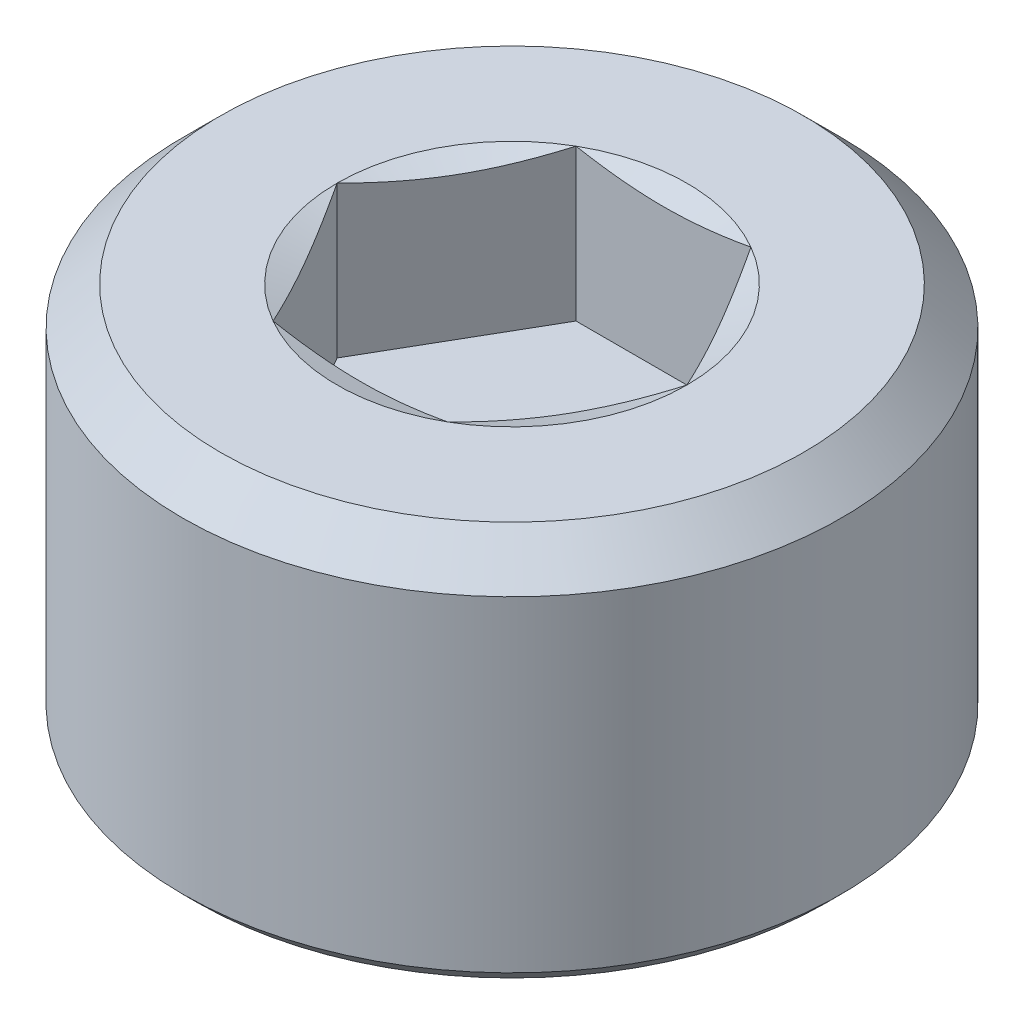
ISO-10303-21;
HEADER;
FILE_DESCRIPTION(('STEP AP214'),'2;1');
FILE_NAME('part.step','',(''),(''),'','','');
FILE_SCHEMA(('AUTOMOTIVE_DESIGN { 1 0 10303 214 1 1 1 1 }'));
ENDSEC;
DATA;
#1=APPLICATION_CONTEXT('core data for automotive mechanical design processes');
#2=APPLICATION_PROTOCOL_DEFINITION('international standard','automotive_design',2000,#1);
#3=PRODUCT_CONTEXT('',#1,'mechanical');
#4=PRODUCT('Part','Part','',(#3));
#5=PRODUCT_RELATED_PRODUCT_CATEGORY('part','',(#4));
#6=PRODUCT_DEFINITION_FORMATION('','',#4);
#7=PRODUCT_DEFINITION_CONTEXT('part definition',#1,'design');
#8=PRODUCT_DEFINITION('design','',#6,#7);
#9=PRODUCT_DEFINITION_SHAPE('','',#8);
#10=(LENGTH_UNIT() NAMED_UNIT(*) SI_UNIT(.MILLI.,.METRE.));
#11=(NAMED_UNIT(*) PLANE_ANGLE_UNIT() SI_UNIT($,.RADIAN.));
#12=(NAMED_UNIT(*) SI_UNIT($,.STERADIAN.) SOLID_ANGLE_UNIT());
#13=UNCERTAINTY_MEASURE_WITH_UNIT(LENGTH_MEASURE(1.E-05),#10,'distance_accuracy_value','');
#14=(GEOMETRIC_REPRESENTATION_CONTEXT(3) GLOBAL_UNCERTAINTY_ASSIGNED_CONTEXT((#13)) GLOBAL_UNIT_ASSIGNED_CONTEXT((#10,
#11,#12)) REPRESENTATION_CONTEXT('',''));
#15=CARTESIAN_POINT('',(0.,0.,0.));
#16=DIRECTION('',(0.,0.,1.));
#17=DIRECTION('',(1.,0.,0.));
#18=AXIS2_PLACEMENT_3D('',#15,#16,#17);
#19=CARTESIAN_POINT('',(0.,5.,0.));
#20=DIRECTION('',(0.,-1.,0.));
#21=DIRECTION('',(0.,0.,-1.));
#22=AXIS2_PLACEMENT_3D('',#19,#20,#21);
#23=CYLINDRICAL_SURFACE('',#22,4.35);
#24=CARTESIAN_POINT('',(0.,0.199999999999999,0.));
#25=DIRECTION('',(0.,1.,0.));
#26=DIRECTION('',(0.,0.,1.));
#27=AXIS2_PLACEMENT_3D('',#24,#25,#26);
#28=CIRCLE('',#27,4.35);
#29=CARTESIAN_POINT('',(0.,0.199999999999999,4.35));
#30=VERTEX_POINT('',#29);
#31=EDGE_CURVE('E52',#30,#30,#28,.T.);
#32=ORIENTED_EDGE('',*,*,#31,.T.);
#33=EDGE_LOOP('',(#32));
#34=FACE_BOUND('',#33,.T.);
#35=CARTESIAN_POINT('',(0.,4.5,0.));
#36=DIRECTION('',(0.,1.,0.));
#37=DIRECTION('',(0.,0.,1.));
#38=AXIS2_PLACEMENT_3D('',#35,#36,#37);
#39=CIRCLE('',#38,4.35);
#40=CARTESIAN_POINT('',(0.,4.5,4.35));
#41=VERTEX_POINT('',#40);
#42=EDGE_CURVE('E337',#41,#41,#39,.F.);
#43=ORIENTED_EDGE('',*,*,#42,.T.);
#44=EDGE_LOOP('',(#43));
#45=FACE_BOUND('',#44,.T.);
#46=ADVANCED_FACE('F43',(#34,#45),#23,.T.);
#47=CARTESIAN_POINT('',(0.,5.,0.));
#48=DIRECTION('',(0.,1.,0.));
#49=DIRECTION('',(0.,0.,1.));
#50=AXIS2_PLACEMENT_3D('',#47,#48,#49);
#51=PLANE('',#50);
#52=CARTESIAN_POINT('',(0.,5.,0.));
#53=DIRECTION('',(0.,1.,0.));
#54=DIRECTION('',(0.,0.,1.));
#55=AXIS2_PLACEMENT_3D('',#52,#53,#54);
#56=CIRCLE('',#55,3.85);
#57=CARTESIAN_POINT('',(0.,5.,3.85));
#58=VERTEX_POINT('',#57);
#59=EDGE_CURVE('E123',#58,#58,#56,.T.);
#60=ORIENTED_EDGE('',*,*,#59,.T.);
#61=EDGE_LOOP('',(#60));
#62=FACE_BOUND('',#61,.T.);
#63=CARTESIAN_POINT('',(0.,5.,0.));
#64=DIRECTION('',(0.,1.,0.));
#65=DIRECTION('',(0.,0.,1.));
#66=AXIS2_PLACEMENT_3D('',#63,#64,#65);
#67=CIRCLE('',#66,2.3094010767585);
#68=CARTESIAN_POINT('',(1.1547018557942,5.,2.00000228116781));
#69=VERTEX_POINT('',#68);
#70=CARTESIAN_POINT('',(2.3094010767585,5.,0.));
#71=VERTEX_POINT('',#70);
#72=EDGE_CURVE('E100',#69,#71,#67,.T.);
#73=ORIENTED_EDGE('',*,*,#72,.F.);
#74=CARTESIAN_POINT('',(-1.15470053837925,5.,2.));
#75=VERTEX_POINT('',#74);
#76=EDGE_CURVE('E58',#75,#69,#67,.T.);
#77=ORIENTED_EDGE('',*,*,#76,.F.);
#78=CARTESIAN_POINT('',(-2.3094010767585,5.,0.));
#79=VERTEX_POINT('',#78);
#80=EDGE_CURVE('E295',#79,#75,#67,.T.);
#81=ORIENTED_EDGE('',*,*,#80,.F.);
#82=CARTESIAN_POINT('',(-1.15470185579421,5.,-2.00000228116781));
#83=VERTEX_POINT('',#82);
#84=EDGE_CURVE('E66',#83,#79,#67,.T.);
#85=ORIENTED_EDGE('',*,*,#84,.F.);
#86=CARTESIAN_POINT('',(1.15469985166359,5.,-1.99999881004499));
#87=VERTEX_POINT('',#86);
#88=EDGE_CURVE('E145',#87,#83,#67,.T.);
#89=ORIENTED_EDGE('',*,*,#88,.F.);
#90=EDGE_CURVE('E111',#71,#87,#67,.T.);
#91=ORIENTED_EDGE('',*,*,#90,.F.);
#92=EDGE_LOOP('',(#73,#77,#81,#85,#89,#91));
#93=FACE_BOUND('',#92,.T.);
#94=ADVANCED_FACE('F144',(#62,#93),#51,.T.);
#95=CARTESIAN_POINT('',(0.,0.,0.));
#96=DIRECTION('',(0.,1.,0.));
#97=DIRECTION('',(0.,0.,1.));
#98=AXIS2_PLACEMENT_3D('',#95,#96,#97);
#99=PLANE('',#98);
#100=CARTESIAN_POINT('',(0.,0.,0.));
#101=DIRECTION('',(0.,1.,0.));
#102=DIRECTION('',(0.,0.,1.));
#103=AXIS2_PLACEMENT_3D('',#100,#101,#102);
#104=CIRCLE('',#103,4.15);
#105=CARTESIAN_POINT('',(0.,0.,4.15));
#106=VERTEX_POINT('',#105);
#107=EDGE_CURVE('E12',#106,#106,#104,.F.);
#108=ORIENTED_EDGE('',*,*,#107,.T.);
#109=EDGE_LOOP('',(#108));
#110=FACE_BOUND('',#109,.T.);
#111=ADVANCED_FACE('F165',(#110),#99,.F.);
#112=CARTESIAN_POINT('',(0.,4.7,0.));
#113=DIRECTION('',(0.,1.,0.));
#114=DIRECTION('',(0.,0.,1.));
#115=AXIS2_PLACEMENT_3D('',#112,#113,#114);
#116=CONICAL_SURFACE('',#115,1.5,1.21584969653141);
#117=ORIENTED_EDGE('',*,*,#90,.T.);
#118=CARTESIAN_POINT('',(2.30951654681234,5.0000428015419,0.000199999999999459));
#119=CARTESIAN_POINT('',(2.2616990180736,4.98231110108641,-0.0826223892678913));
#120=CARTESIAN_POINT('',(2.21371813834115,4.96617830162448,-0.16572771075634));
#121=CARTESIAN_POINT('',(2.11743284030509,4.93779178888623,-0.33249873897671));
#122=CARTESIAN_POINT('',(2.06912819095459,4.92554123557946,-0.416164845893564));
#123=CARTESIAN_POINT('',(1.97275103462017,4.90572913590812,-0.583094977353804));
#124=CARTESIAN_POINT('',(1.92468089421695,4.89812279889732,-0.666354902859147));
#125=CARTESIAN_POINT('',(1.8284240698117,4.8879203165271,-0.833076613304273));
#126=CARTESIAN_POINT('',(1.78023743869029,4.88532221454501,-0.916538306652137));
#127=CARTESIAN_POINT('',(1.68386417644747,4.88532221454501,-1.08346169334786));
#128=CARTESIAN_POINT('',(1.63567754532605,4.8879203165271,-1.16692338669573));
#129=CARTESIAN_POINT('',(1.53942072092081,4.89812279889732,-1.33364509714085));
#130=CARTESIAN_POINT('',(1.49135058051759,4.90572913590812,-1.4169050226462));
#131=CARTESIAN_POINT('',(1.39497342418316,4.92554123557946,-1.58383515410644));
#132=CARTESIAN_POINT('',(1.34666877483267,4.93779178888623,-1.66750126102329));
#133=CARTESIAN_POINT('',(1.2503834767966,4.96617830162448,-1.83427228924366));
#134=CARTESIAN_POINT('',(1.20240259706416,4.98231110108641,-1.91737761073211));
#135=CARTESIAN_POINT('',(1.15458506832541,5.0000428015419,-2.0002));
#136=B_SPLINE_CURVE_WITH_KNOTS('',3,(#118,#119,#120,#121,#122,#123,#124,#125,#126,#127,#128,
#129,#130,#131,#132,#133,#134,#135),.UNSPECIFIED.,.F.,.F.,(4,2,2,2,2,2,2,2,4),(0.,
0.291826340433017,0.583889607574753,0.873089675127141,1.16217673476816,1.45126379440919,
1.74046386196158,2.03252712910331,2.32435346953633),.UNSPECIFIED.);
#137=EDGE_CURVE('E117',#71,#87,#136,.T.);
#138=ORIENTED_EDGE('',*,*,#137,.F.);
#139=EDGE_LOOP('',(#117,#138));
#140=FACE_BOUND('',#139,.T.);
#141=ADVANCED_FACE('F118',(#140),#116,.F.);
#142=ORIENTED_EDGE('',*,*,#88,.T.);
#143=CARTESIAN_POINT('',(3.48371855259447,5.63291230268999,-2.));
#144=CARTESIAN_POINT('',(3.3487826248163,5.58956841889575,-2.));
#145=CARTESIAN_POINT('',(3.2136761428419,5.54673759086952,-2.));
#146=CARTESIAN_POINT('',(2.94296238835406,5.46258118319886,-2.));
#147=CARTESIAN_POINT('',(2.807355008678,5.42125594899759,-2.));
#148=CARTESIAN_POINT('',(2.53352754183587,5.34001263678583,-2.));
#149=CARTESIAN_POINT('',(2.39529851306173,5.30012447972504,-2.));
#150=CARTESIAN_POINT('',(2.1180458094453,5.22321630781469,-2.));
#151=CARTESIAN_POINT('',(1.97902216975503,5.1861961671282,-2.));
#152=CARTESIAN_POINT('',(1.70601505685474,5.11769516497388,-2.));
#153=CARTESIAN_POINT('',(1.57207521358363,5.08604345882237,-2.));
#154=CARTESIAN_POINT('',(1.37033154252605,5.0424041276242,-2.));
#155=CARTESIAN_POINT('',(1.30294359191739,5.02849719834776,-2.));
#156=CARTESIAN_POINT('',(1.16786010745201,5.00218459664255,-2.));
#157=CARTESIAN_POINT('',(1.1001645079874,4.98977926168497,-2.));
#158=CARTESIAN_POINT('',(0.897714603559934,4.95536243402508,-2.));
#159=CARTESIAN_POINT('',(0.762507863765337,4.93590703682516,-2.));
#160=CARTESIAN_POINT('',(0.491112040376663,4.9058435971261,-2.));
#161=CARTESIAN_POINT('',(0.354923290417337,4.89523268053384,-2.));
#162=CARTESIAN_POINT('',(0.141654072913857,4.88663498881944,-2.));
#163=CARTESIAN_POINT('',(0.0647051504781063,4.88516040069001,-2.));
#164=CARTESIAN_POINT('',(-0.0891887123532253,4.88551180076652,-2.));
#165=CARTESIAN_POINT('',(-0.166133652671896,4.88733783841127,-2.));
#166=CARTESIAN_POINT('',(-0.319895647186918,4.89421090097877,-2.));
#167=CARTESIAN_POINT('',(-0.396712666249752,4.8992586990056,-2.));
#168=CARTESIAN_POINT('',(-0.550093987387917,4.91235242572707,-2.));
#169=CARTESIAN_POINT('',(-0.626658262100086,4.92039866895766,-2.));
#170=CARTESIAN_POINT('',(-0.857178121466548,4.94873493543358,-2.));
#171=CARTESIAN_POINT('',(-1.01062920789434,4.97315359080106,-2.));
#172=CARTESIAN_POINT('',(-1.3159850754844,5.03004529730951,-2.));
#173=CARTESIAN_POINT('',(-1.46788962366047,5.06251954386808,-2.));
#174=CARTESIAN_POINT('',(-1.77803352318111,5.1348510761675,-2.));
#175=CARTESIAN_POINT('',(-1.93620402343221,5.17499900698825,-2.));
#176=CARTESIAN_POINT('',(-2.25139875783329,5.25948034862204,-2.));
#177=CARTESIAN_POINT('',(-2.40842303967896,5.30381358419697,-2.));
#178=CARTESIAN_POINT('',(-2.71884765671336,5.39455077969801,-2.));
#179=CARTESIAN_POINT('',(-2.872262892653,5.44090410667233,-2.));
#180=CARTESIAN_POINT('',(-3.10190312651026,5.51190904978709,-2.));
#181=CARTESIAN_POINT('',(-3.17835893158383,5.53581979297233,-2.));
#182=CARTESIAN_POINT('',(-3.33113503560862,5.58406524208518,-2.));
#183=CARTESIAN_POINT('',(-3.40745533725798,5.60839993946435,-2.));
#184=CARTESIAN_POINT('',(-3.48371855259447,5.63291230268999,-2.));
#185=B_SPLINE_CURVE_WITH_KNOTS('',3,(#143,#144,#145,#146,#147,#148,#149,#150,#151,#152,#153,
#154,#155,#156,#157,#158,#159,#160,#161,#162,#163,#164,#165,#166,#167,#168,#169,#170,#171,#172,
#173,#174,#175,#176,#177,#178,#179,#180,#181,#182,#183,#184),.UNSPECIFIED.,.F.,.F.,(4,2,2,2,2,2,
2,2,2,2,2,2,2,2,2,2,2,2,2,2,4),(0.,0.425186608085215,0.850470164295772,1.28205489330551,
1.71362067539157,2.12642499337812,2.33283370287353,2.53928871526623,2.9488538303595,
3.35828580165827,3.5891106242748,3.81993890435609,4.05082259557539,4.28173051324026,
4.74753623703261,5.21341112593148,5.7028830682672,6.19233452556315,6.67311032937181,
6.91343200462582,7.15374883972743),.UNSPECIFIED.);
#186=EDGE_CURVE('E110',#87,#83,#185,.T.);
#187=ORIENTED_EDGE('',*,*,#186,.F.);
#188=EDGE_LOOP('',(#142,#187));
#189=FACE_BOUND('',#188,.T.);
#190=ADVANCED_FACE('F354',(#189),#116,.F.);
#191=ORIENTED_EDGE('',*,*,#84,.T.);
#192=CARTESIAN_POINT('',(-1.15458506832541,5.0000428015419,-2.0002));
#193=CARTESIAN_POINT('',(-1.20240259706416,4.98231110108641,-1.91737761073211));
#194=CARTESIAN_POINT('',(-1.2503834767966,4.96617830162448,-1.83427228924366));
#195=CARTESIAN_POINT('',(-1.34666877483266,4.93779178888623,-1.66750126102329));
#196=CARTESIAN_POINT('',(-1.39497342418316,4.92554123557946,-1.58383515410644));
#197=CARTESIAN_POINT('',(-1.49135058051759,4.90572913590812,-1.4169050226462));
#198=CARTESIAN_POINT('',(-1.53942072092081,4.89812279889732,-1.33364509714085));
#199=CARTESIAN_POINT('',(-1.63567754532605,4.8879203165271,-1.16692338669573));
#200=CARTESIAN_POINT('',(-1.68386417644746,4.88532221454501,-1.08346169334786));
#201=CARTESIAN_POINT('',(-1.78023743869029,4.88532221454501,-0.916538306652136));
#202=CARTESIAN_POINT('',(-1.8284240698117,4.8879203165271,-0.833076613304272));
#203=CARTESIAN_POINT('',(-1.92468089421695,4.89812279889732,-0.666354902859147));
#204=CARTESIAN_POINT('',(-1.97275103462017,4.90572913590812,-0.583094977353804));
#205=CARTESIAN_POINT('',(-2.06912819095459,4.92554123557946,-0.416164845893563));
#206=CARTESIAN_POINT('',(-2.11743284030509,4.93779178888623,-0.33249873897671));
#207=CARTESIAN_POINT('',(-2.21371813834115,4.96617830162448,-0.16572771075634));
#208=CARTESIAN_POINT('',(-2.2616990180736,4.98231110108641,-0.0826223892678906));
#209=CARTESIAN_POINT('',(-2.30951654681234,5.0000428015419,0.000199999999999934));
#210=B_SPLINE_CURVE_WITH_KNOTS('',3,(#192,#193,#194,#195,#196,#197,#198,#199,#200,#201,#202,
#203,#204,#205,#206,#207,#208,#209),.UNSPECIFIED.,.F.,.F.,(4,2,2,2,2,2,2,2,4),(0.,
0.291826340433017,0.583889607574754,0.873089675127141,1.16217673476816,1.45126379440919,
1.74046386196158,2.03252712910331,2.32435346953633),.UNSPECIFIED.);
#211=EDGE_CURVE('E298',#83,#79,#210,.T.);
#212=ORIENTED_EDGE('',*,*,#211,.F.);
#213=EDGE_LOOP('',(#191,#212));
#214=FACE_BOUND('',#213,.T.);
#215=ADVANCED_FACE('F316',(#214),#116,.F.);
#216=ORIENTED_EDGE('',*,*,#80,.T.);
#217=CARTESIAN_POINT('',(-2.30951654681234,5.0000428015419,-0.000199999999999973));
#218=CARTESIAN_POINT('',(-2.2616990180736,4.98231110108641,0.0826223892678904));
#219=CARTESIAN_POINT('',(-2.21371813834115,4.96617830162448,0.16572771075634));
#220=CARTESIAN_POINT('',(-2.11743284030509,4.93779178888623,0.33249873897671));
#221=CARTESIAN_POINT('',(-2.06912819095459,4.92554123557946,0.416164845893563));
#222=CARTESIAN_POINT('',(-1.97275103462017,4.90572913590812,0.583094977353804));
#223=CARTESIAN_POINT('',(-1.92468089421695,4.89812279889732,0.666354902859147));
#224=CARTESIAN_POINT('',(-1.8284240698117,4.8879203165271,0.833076613304272));
#225=CARTESIAN_POINT('',(-1.78023743869029,4.88532221454501,0.916538306652136));
#226=CARTESIAN_POINT('',(-1.68386417644747,4.88532221454501,1.08346169334786));
#227=CARTESIAN_POINT('',(-1.63567754532605,4.8879203165271,1.16692338669573));
#228=CARTESIAN_POINT('',(-1.53942072092081,4.89812279889732,1.33364509714085));
#229=CARTESIAN_POINT('',(-1.49135058051759,4.90572913590812,1.4169050226462));
#230=CARTESIAN_POINT('',(-1.39497342418316,4.92554123557946,1.58383515410644));
#231=CARTESIAN_POINT('',(-1.34666877483266,4.93779178888623,1.66750126102329));
#232=CARTESIAN_POINT('',(-1.2503834767966,4.96617830162448,1.83427228924366));
#233=CARTESIAN_POINT('',(-1.20240259706416,4.98231110108641,1.91737761073211));
#234=CARTESIAN_POINT('',(-1.15458506832541,5.0000428015419,2.0002));
#235=B_SPLINE_CURVE_WITH_KNOTS('',3,(#217,#218,#219,#220,#221,#222,#223,#224,#225,#226,#227,
#228,#229,#230,#231,#232,#233,#234),.UNSPECIFIED.,.F.,.F.,(4,2,2,2,2,2,2,2,4),(0.,
0.291826340433017,0.583889607574753,0.87308967512714,1.16217673476816,1.45126379440919,
1.74046386196158,2.03252712910331,2.32435346953633),.UNSPECIFIED.);
#236=EDGE_CURVE('E302',#79,#75,#235,.T.);
#237=ORIENTED_EDGE('',*,*,#236,.F.);
#238=EDGE_LOOP('',(#216,#237));
#239=FACE_BOUND('',#238,.T.);
#240=ADVANCED_FACE('F312',(#239),#116,.F.);
#241=ORIENTED_EDGE('',*,*,#76,.T.);
#242=CARTESIAN_POINT('',(-3.48371855259447,5.63291230268999,2.));
#243=CARTESIAN_POINT('',(-3.3487826248163,5.58956841889575,2.));
#244=CARTESIAN_POINT('',(-3.2136761428419,5.54673759086952,2.));
#245=CARTESIAN_POINT('',(-2.94296238835406,5.46258118319886,2.));
#246=CARTESIAN_POINT('',(-2.807355008678,5.42125594899759,2.));
#247=CARTESIAN_POINT('',(-2.53352754183587,5.34001263678583,2.));
#248=CARTESIAN_POINT('',(-2.39529851306173,5.30012447972504,2.));
#249=CARTESIAN_POINT('',(-2.1180458094453,5.22321630781469,2.));
#250=CARTESIAN_POINT('',(-1.97902216975503,5.18619616712819,2.));
#251=CARTESIAN_POINT('',(-1.70601505685474,5.11769516497388,2.));
#252=CARTESIAN_POINT('',(-1.57207521358363,5.08604345882237,2.));
#253=CARTESIAN_POINT('',(-1.37033154252605,5.0424041276242,2.));
#254=CARTESIAN_POINT('',(-1.30294359191739,5.02849719834776,2.));
#255=CARTESIAN_POINT('',(-1.16786010745201,5.00218459664255,2.));
#256=CARTESIAN_POINT('',(-1.1001645079874,4.98977926168497,2.));
#257=CARTESIAN_POINT('',(-0.897714603559934,4.95536243402508,2.));
#258=CARTESIAN_POINT('',(-0.762507863765337,4.93590703682516,2.));
#259=CARTESIAN_POINT('',(-0.491112040376664,4.9058435971261,2.));
#260=CARTESIAN_POINT('',(-0.354923290417338,4.89523268053384,2.));
#261=CARTESIAN_POINT('',(-0.141654072913857,4.88663498881944,2.));
#262=CARTESIAN_POINT('',(-0.0647051504781067,4.88516040069001,2.));
#263=CARTESIAN_POINT('',(0.0891887123532248,4.88551180076652,2.));
#264=CARTESIAN_POINT('',(0.166133652671895,4.88733783841127,2.));
#265=CARTESIAN_POINT('',(0.319895647186918,4.89421090097877,2.));
#266=CARTESIAN_POINT('',(0.396712666249752,4.8992586990056,2.));
#267=CARTESIAN_POINT('',(0.550093987387917,4.91235242572707,2.));
#268=CARTESIAN_POINT('',(0.626658262100086,4.92039866895766,2.));
#269=CARTESIAN_POINT('',(0.857178121466547,4.94873493543358,2.));
#270=CARTESIAN_POINT('',(1.01062920789434,4.97315359080106,2.));
#271=CARTESIAN_POINT('',(1.3159850754844,5.03004529730951,2.));
#272=CARTESIAN_POINT('',(1.46788962366047,5.06251954386808,2.));
#273=CARTESIAN_POINT('',(1.77803352318111,5.1348510761675,2.));
#274=CARTESIAN_POINT('',(1.93620402343221,5.17499900698825,2.));
#275=CARTESIAN_POINT('',(2.25139875783329,5.25948034862204,2.));
#276=CARTESIAN_POINT('',(2.40842303967896,5.30381358419697,2.));
#277=CARTESIAN_POINT('',(2.71884765671336,5.39455077969801,2.));
#278=CARTESIAN_POINT('',(2.872262892653,5.44090410667233,2.));
#279=CARTESIAN_POINT('',(3.10190312651026,5.51190904978709,2.));
#280=CARTESIAN_POINT('',(3.17835893158383,5.53581979297233,2.));
#281=CARTESIAN_POINT('',(3.33113503560863,5.58406524208518,2.));
#282=CARTESIAN_POINT('',(3.40745533725798,5.60839993946435,2.));
#283=CARTESIAN_POINT('',(3.48371855259447,5.63291230268999,2.));
#284=B_SPLINE_CURVE_WITH_KNOTS('',3,(#242,#243,#244,#245,#246,#247,#248,#249,#250,#251,#252,
#253,#254,#255,#256,#257,#258,#259,#260,#261,#262,#263,#264,#265,#266,#267,#268,#269,#270,#271,
#272,#273,#274,#275,#276,#277,#278,#279,#280,#281,#282,#283),.UNSPECIFIED.,.F.,.F.,(4,2,2,2,2,2,
2,2,2,2,2,2,2,2,2,2,2,2,2,2,4),(0.,0.425186608085215,0.850470164295772,1.28205489330551,
1.71362067539157,2.12642499337812,2.33283370287353,2.53928871526623,2.9488538303595,
3.35828580165827,3.5891106242748,3.81993890435609,4.05082259557539,4.28173051324026,
4.74753623703261,5.21341112593148,5.7028830682672,6.19233452556315,6.67311032937181,
6.91343200462582,7.15374883972743),.UNSPECIFIED.);
#285=EDGE_CURVE('E133',#75,#69,#284,.T.);
#286=ORIENTED_EDGE('',*,*,#285,.F.);
#287=EDGE_LOOP('',(#241,#286));
#288=FACE_BOUND('',#287,.T.);
#289=ADVANCED_FACE('F218',(#288),#116,.F.);
#290=ORIENTED_EDGE('',*,*,#72,.T.);
#291=CARTESIAN_POINT('',(1.15458506832541,5.0000428015419,2.0002));
#292=CARTESIAN_POINT('',(1.20240259706416,4.98231110108641,1.91737761073211));
#293=CARTESIAN_POINT('',(1.2503834767966,4.96617830162448,1.83427228924366));
#294=CARTESIAN_POINT('',(1.34666877483267,4.93779178888623,1.66750126102329));
#295=CARTESIAN_POINT('',(1.39497342418316,4.92554123557946,1.58383515410644));
#296=CARTESIAN_POINT('',(1.49135058051759,4.90572913590812,1.4169050226462));
#297=CARTESIAN_POINT('',(1.53942072092081,4.89812279889732,1.33364509714085));
#298=CARTESIAN_POINT('',(1.63567754532605,4.8879203165271,1.16692338669573));
#299=CARTESIAN_POINT('',(1.68386417644747,4.88532221454501,1.08346169334786));
#300=CARTESIAN_POINT('',(1.78023743869029,4.88532221454501,0.916538306652136));
#301=CARTESIAN_POINT('',(1.8284240698117,4.8879203165271,0.833076613304272));
#302=CARTESIAN_POINT('',(1.92468089421695,4.89812279889732,0.666354902859147));
#303=CARTESIAN_POINT('',(1.97275103462017,4.90572913590812,0.583094977353804));
#304=CARTESIAN_POINT('',(2.06912819095459,4.92554123557946,0.416164845893563));
#305=CARTESIAN_POINT('',(2.11743284030509,4.93779178888623,0.33249873897671));
#306=CARTESIAN_POINT('',(2.21371813834115,4.96617830162448,0.16572771075634));
#307=CARTESIAN_POINT('',(2.2616990180736,4.98231110108641,0.0826223892678907));
#308=CARTESIAN_POINT('',(2.30951654681234,5.0000428015419,-0.000200000000000109));
#309=B_SPLINE_CURVE_WITH_KNOTS('',3,(#291,#292,#293,#294,#295,#296,#297,#298,#299,#300,#301,
#302,#303,#304,#305,#306,#307,#308),.UNSPECIFIED.,.F.,.F.,(4,2,2,2,2,2,2,2,4),(0.,
0.291826340433018,0.583889607574754,0.873089675127141,1.16217673476816,1.45126379440919,
1.74046386196158,2.03252712910331,2.32435346953633),.UNSPECIFIED.);
#310=EDGE_CURVE('E105',#69,#71,#309,.T.);
#311=ORIENTED_EDGE('',*,*,#310,.F.);
#312=EDGE_LOOP('',(#290,#311));
#313=FACE_BOUND('',#312,.T.);
#314=ADVANCED_FACE('F103',(#313),#116,.F.);
#315=CARTESIAN_POINT('',(0.,3.,0.));
#316=DIRECTION('',(0.,1.,0.));
#317=DIRECTION('',(0.,0.,1.));
#318=AXIS2_PLACEMENT_3D('',#315,#316,#317);
#319=PLANE('',#318);
#320=DIRECTION('',(0.5,0.,-0.866025403784439));
#321=VECTOR('',#320,1.);
#322=CARTESIAN_POINT('',(1.15470053837925,3.,2.));
#323=LINE('',#322,#321);
#324=CARTESIAN_POINT('',(1.15470053837925,3.,2.));
#325=VERTEX_POINT('',#324);
#326=CARTESIAN_POINT('',(2.3094010767585,3.,0.));
#327=VERTEX_POINT('',#326);
#328=EDGE_CURVE('E132',#325,#327,#323,.T.);
#329=ORIENTED_EDGE('',*,*,#328,.T.);
#330=DIRECTION('',(-0.5,0.,-0.866025403784438));
#331=VECTOR('',#330,1.);
#332=CARTESIAN_POINT('',(2.3094010767585,3.,0.));
#333=LINE('',#332,#331);
#334=CARTESIAN_POINT('',(1.15470053837925,3.,-2.));
#335=VERTEX_POINT('',#334);
#336=EDGE_CURVE('E137',#327,#335,#333,.T.);
#337=ORIENTED_EDGE('',*,*,#336,.T.);
#338=DIRECTION('',(-1.,0.,0.));
#339=VECTOR('',#338,1.);
#340=CARTESIAN_POINT('',(1.15470053837925,3.,-2.));
#341=LINE('',#340,#339);
#342=CARTESIAN_POINT('',(-1.15470053837925,3.,-2.));
#343=VERTEX_POINT('',#342);
#344=EDGE_CURVE('E493',#335,#343,#341,.T.);
#345=ORIENTED_EDGE('',*,*,#344,.T.);
#346=DIRECTION('',(-0.5,0.,0.866025403784439));
#347=VECTOR('',#346,1.);
#348=CARTESIAN_POINT('',(-1.15470053837925,3.,-2.));
#349=LINE('',#348,#347);
#350=CARTESIAN_POINT('',(-2.3094010767585,3.,0.));
#351=VERTEX_POINT('',#350);
#352=EDGE_CURVE('E494',#343,#351,#349,.T.);
#353=ORIENTED_EDGE('',*,*,#352,.T.);
#354=DIRECTION('',(0.5,0.,0.866025403784438));
#355=VECTOR('',#354,1.);
#356=CARTESIAN_POINT('',(-2.3094010767585,3.,0.));
#357=LINE('',#356,#355);
#358=CARTESIAN_POINT('',(-1.15470053837925,3.,2.));
#359=VERTEX_POINT('',#358);
#360=EDGE_CURVE('E479',#351,#359,#357,.T.);
#361=ORIENTED_EDGE('',*,*,#360,.T.);
#362=DIRECTION('',(1.,0.,0.));
#363=VECTOR('',#362,1.);
#364=CARTESIAN_POINT('',(-1.15470053837925,3.,2.));
#365=LINE('',#364,#363);
#366=EDGE_CURVE('E140',#359,#325,#365,.T.);
#367=ORIENTED_EDGE('',*,*,#366,.T.);
#368=EDGE_LOOP('',(#329,#337,#345,#353,#361,#367));
#369=FACE_BOUND('',#368,.T.);
#370=ADVANCED_FACE('F217',(#369),#319,.T.);
#371=CARTESIAN_POINT('',(2.3094010767585,3.,0.));
#372=DIRECTION('',(0.866025403784439,0.,-0.5));
#373=DIRECTION('',(-0.5,0.,-0.866025403784438));
#374=AXIS2_PLACEMENT_3D('',#371,#372,#373);
#375=PLANE('',#374);
#376=DIRECTION('',(0.,1.,0.));
#377=VECTOR('',#376,1.);
#378=CARTESIAN_POINT('',(2.3094010767585,3.,0.));
#379=LINE('',#378,#377);
#380=EDGE_CURVE('E130',#327,#71,#379,.T.);
#381=ORIENTED_EDGE('',*,*,#380,.T.);
#382=ORIENTED_EDGE('',*,*,#137,.T.);
#383=DIRECTION('',(0.,1.,0.));
#384=VECTOR('',#383,1.);
#385=CARTESIAN_POINT('',(1.15470053837925,3.,-2.));
#386=LINE('',#385,#384);
#387=EDGE_CURVE('E139',#335,#87,#386,.T.);
#388=ORIENTED_EDGE('',*,*,#387,.F.);
#389=ORIENTED_EDGE('',*,*,#336,.F.);
#390=EDGE_LOOP('',(#381,#382,#388,#389));
#391=FACE_BOUND('',#390,.T.);
#392=ADVANCED_FACE('F135',(#391),#375,.F.);
#393=CARTESIAN_POINT('',(1.15470053837925,3.,-2.));
#394=DIRECTION('',(0.,0.,-1.));
#395=DIRECTION('',(-1.,0.,0.));
#396=AXIS2_PLACEMENT_3D('',#393,#394,#395);
#397=PLANE('',#396);
#398=ORIENTED_EDGE('',*,*,#387,.T.);
#399=ORIENTED_EDGE('',*,*,#186,.T.);
#400=DIRECTION('',(0.,1.,0.));
#401=VECTOR('',#400,1.);
#402=CARTESIAN_POINT('',(-1.15470053837925,3.,-2.));
#403=LINE('',#402,#401);
#404=EDGE_CURVE('E482',#343,#83,#403,.T.);
#405=ORIENTED_EDGE('',*,*,#404,.F.);
#406=ORIENTED_EDGE('',*,*,#344,.F.);
#407=EDGE_LOOP('',(#398,#399,#405,#406));
#408=FACE_BOUND('',#407,.T.);
#409=ADVANCED_FACE('F434',(#408),#397,.F.);
#410=CARTESIAN_POINT('',(-1.15470053837925,3.,-2.));
#411=DIRECTION('',(-0.866025403784439,0.,-0.5));
#412=DIRECTION('',(-0.5,0.,0.866025403784439));
#413=AXIS2_PLACEMENT_3D('',#410,#411,#412);
#414=PLANE('',#413);
#415=ORIENTED_EDGE('',*,*,#404,.T.);
#416=ORIENTED_EDGE('',*,*,#211,.T.);
#417=DIRECTION('',(0.,1.,0.));
#418=VECTOR('',#417,1.);
#419=CARTESIAN_POINT('',(-2.3094010767585,3.,0.));
#420=LINE('',#419,#418);
#421=EDGE_CURVE('E477',#351,#79,#420,.T.);
#422=ORIENTED_EDGE('',*,*,#421,.F.);
#423=ORIENTED_EDGE('',*,*,#352,.F.);
#424=EDGE_LOOP('',(#415,#416,#422,#423));
#425=FACE_BOUND('',#424,.T.);
#426=ADVANCED_FACE('F441',(#425),#414,.F.);
#427=CARTESIAN_POINT('',(-2.3094010767585,3.,0.));
#428=DIRECTION('',(-0.866025403784439,0.,0.5));
#429=DIRECTION('',(0.5,0.,0.866025403784438));
#430=AXIS2_PLACEMENT_3D('',#427,#428,#429);
#431=PLANE('',#430);
#432=ORIENTED_EDGE('',*,*,#421,.T.);
#433=ORIENTED_EDGE('',*,*,#236,.T.);
#434=DIRECTION('',(0.,1.,0.));
#435=VECTOR('',#434,1.);
#436=CARTESIAN_POINT('',(-1.15470053837925,3.,2.));
#437=LINE('',#436,#435);
#438=EDGE_CURVE('E310',#359,#75,#437,.T.);
#439=ORIENTED_EDGE('',*,*,#438,.F.);
#440=ORIENTED_EDGE('',*,*,#360,.F.);
#441=EDGE_LOOP('',(#432,#433,#439,#440));
#442=FACE_BOUND('',#441,.T.);
#443=ADVANCED_FACE('F448',(#442),#431,.F.);
#444=CARTESIAN_POINT('',(-1.15470053837925,3.,2.));
#445=DIRECTION('',(0.,0.,1.));
#446=DIRECTION('',(1.,0.,0.));
#447=AXIS2_PLACEMENT_3D('',#444,#445,#446);
#448=PLANE('',#447);
#449=ORIENTED_EDGE('',*,*,#438,.T.);
#450=ORIENTED_EDGE('',*,*,#285,.T.);
#451=DIRECTION('',(0.,1.,0.));
#452=VECTOR('',#451,1.);
#453=CARTESIAN_POINT('',(1.15470053837925,3.,2.));
#454=LINE('',#453,#452);
#455=EDGE_CURVE('E124',#325,#69,#454,.T.);
#456=ORIENTED_EDGE('',*,*,#455,.F.);
#457=ORIENTED_EDGE('',*,*,#366,.F.);
#458=EDGE_LOOP('',(#449,#450,#456,#457));
#459=FACE_BOUND('',#458,.T.);
#460=ADVANCED_FACE('F308',(#459),#448,.F.);
#461=CARTESIAN_POINT('',(1.15470053837925,3.,2.));
#462=DIRECTION('',(0.866025403784439,0.,0.5));
#463=DIRECTION('',(0.5,0.,-0.866025403784439));
#464=AXIS2_PLACEMENT_3D('',#461,#462,#463);
#465=PLANE('',#464);
#466=ORIENTED_EDGE('',*,*,#455,.T.);
#467=ORIENTED_EDGE('',*,*,#310,.T.);
#468=ORIENTED_EDGE('',*,*,#380,.F.);
#469=ORIENTED_EDGE('',*,*,#328,.F.);
#470=EDGE_LOOP('',(#466,#467,#468,#469));
#471=FACE_BOUND('',#470,.T.);
#472=ADVANCED_FACE('F128',(#471),#465,.F.);
#473=CARTESIAN_POINT('',(0.,5.,0.));
#474=DIRECTION('',(0.,-1.,0.));
#475=DIRECTION('',(0.,0.,-1.));
#476=AXIS2_PLACEMENT_3D('',#473,#474,#475);
#477=CONICAL_SURFACE('',#476,3.85,0.785398163397447);
#478=ORIENTED_EDGE('',*,*,#42,.F.);
#479=EDGE_LOOP('',(#478));
#480=FACE_BOUND('',#479,.T.);
#481=ORIENTED_EDGE('',*,*,#59,.F.);
#482=EDGE_LOOP('',(#481));
#483=FACE_BOUND('',#482,.T.);
#484=ADVANCED_FACE('F324',(#480,#483),#477,.T.);
#485=CARTESIAN_POINT('',(0.,0.199999999999999,0.));
#486=DIRECTION('',(0.,1.,0.));
#487=DIRECTION('',(0.,0.,1.));
#488=AXIS2_PLACEMENT_3D('',#485,#486,#487);
#489=CONICAL_SURFACE('',#488,4.35,0.78539816339745);
#490=ORIENTED_EDGE('',*,*,#107,.F.);
#491=EDGE_LOOP('',(#490));
#492=FACE_BOUND('',#491,.T.);
#493=ORIENTED_EDGE('',*,*,#31,.F.);
#494=EDGE_LOOP('',(#493));
#495=FACE_BOUND('',#494,.T.);
#496=ADVANCED_FACE('F46',(#492,#495),#489,.T.);
#497=CLOSED_SHELL('',(#46,#94,#111,#141,#190,#215,#240,#289,#314,#370,#392,#409,#426,#443,#460,
#472,#484,#496));
#498=MANIFOLD_SOLID_BREP('B2',#497);
#499=ADVANCED_BREP_SHAPE_REPRESENTATION('',(#18,#498),#14);
#500=SHAPE_DEFINITION_REPRESENTATION(#9,#499);
ENDSEC;
END-ISO-10303-21;
